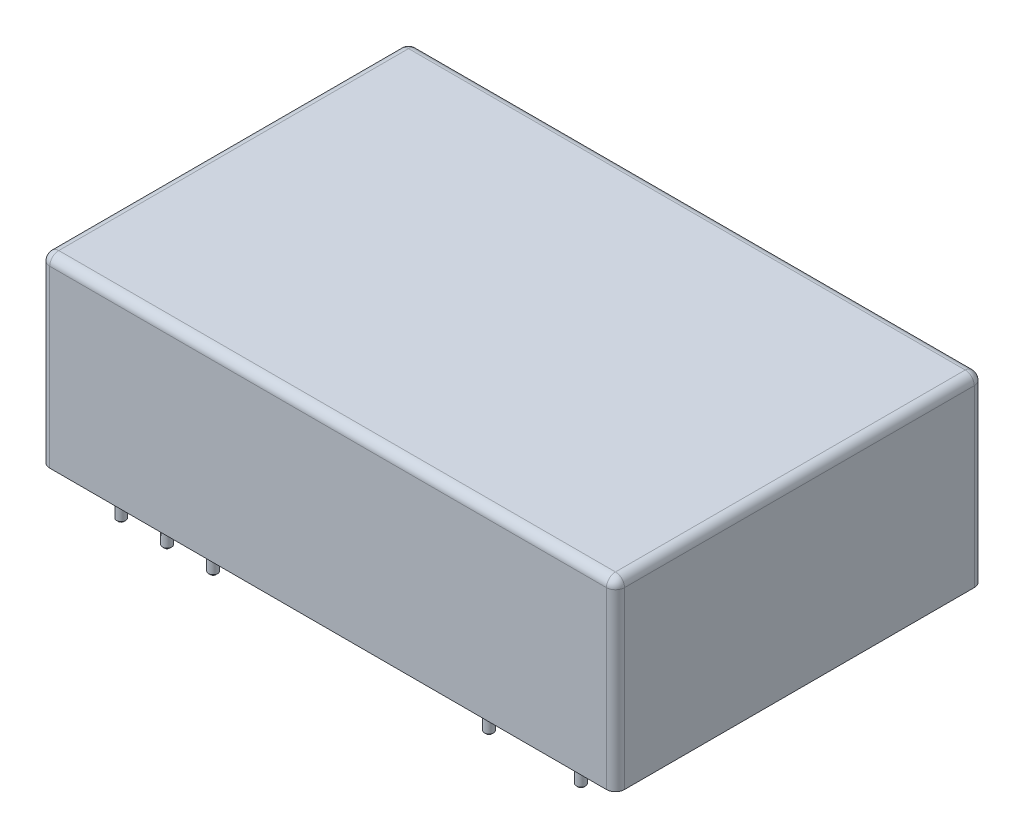
ISO-10303-21;
HEADER;
FILE_DESCRIPTION(('STEP AP214'),'2;1');
FILE_NAME('part.step','',(''),(''),'','','');
FILE_SCHEMA(('AUTOMOTIVE_DESIGN { 1 0 10303 214 1 1 1 1 }'));
ENDSEC;
DATA;
#1=APPLICATION_CONTEXT('core data for automotive mechanical design processes');
#2=APPLICATION_PROTOCOL_DEFINITION('international standard','automotive_design',2000,#1);
#3=PRODUCT_CONTEXT('',#1,'mechanical');
#4=PRODUCT('Part','Part','',(#3));
#5=PRODUCT_RELATED_PRODUCT_CATEGORY('part','',(#4));
#6=PRODUCT_DEFINITION_FORMATION('','',#4);
#7=PRODUCT_DEFINITION_CONTEXT('part definition',#1,'design');
#8=PRODUCT_DEFINITION('design','',#6,#7);
#9=PRODUCT_DEFINITION_SHAPE('','',#8);
#10=(LENGTH_UNIT() NAMED_UNIT(*) SI_UNIT(.MILLI.,.METRE.));
#11=(NAMED_UNIT(*) PLANE_ANGLE_UNIT() SI_UNIT($,.RADIAN.));
#12=(NAMED_UNIT(*) SI_UNIT($,.STERADIAN.) SOLID_ANGLE_UNIT());
#13=UNCERTAINTY_MEASURE_WITH_UNIT(LENGTH_MEASURE(1.E-05),#10,'distance_accuracy_value','');
#14=(GEOMETRIC_REPRESENTATION_CONTEXT(3) GLOBAL_UNCERTAINTY_ASSIGNED_CONTEXT((#13)) GLOBAL_UNIT_ASSIGNED_CONTEXT((#10,
#11,#12)) REPRESENTATION_CONTEXT('',''));
#15=CARTESIAN_POINT('',(0.,0.,0.));
#16=DIRECTION('',(0.,0.,1.));
#17=DIRECTION('',(1.,0.,0.));
#18=AXIS2_PLACEMENT_3D('',#15,#16,#17);
#19=CARTESIAN_POINT('',(-15.375,9.66,9.66));
#20=DIRECTION('',(1.,0.,0.));
#21=DIRECTION('',(0.,0.,-1.));
#22=AXIS2_PLACEMENT_3D('',#19,#20,#21);
#23=SPHERICAL_SURFACE('',#22,0.5);
#24=CARTESIAN_POINT('',(-15.375,9.66,9.66));
#25=DIRECTION('',(-1.,0.,0.));
#26=DIRECTION('',(0.,0.,1.));
#27=AXIS2_PLACEMENT_3D('',#24,#25,#26);
#28=CIRCLE('',#27,0.5);
#29=CARTESIAN_POINT('',(-15.375,10.16,9.66));
#30=VERTEX_POINT('',#29);
#31=CARTESIAN_POINT('',(-15.375,9.66,10.16));
#32=VERTEX_POINT('',#31);
#33=EDGE_CURVE('E201',#30,#32,#28,.F.);
#34=ORIENTED_EDGE('',*,*,#33,.F.);
#35=CARTESIAN_POINT('',(-15.375,9.66,9.66));
#36=DIRECTION('',(0.,0.,-1.));
#37=DIRECTION('',(-1.,0.,0.));
#38=AXIS2_PLACEMENT_3D('',#35,#36,#37);
#39=CIRCLE('',#38,0.5);
#40=CARTESIAN_POINT('',(-15.875,9.66,9.66));
#41=VERTEX_POINT('',#40);
#42=EDGE_CURVE('E229',#41,#30,#39,.T.);
#43=ORIENTED_EDGE('',*,*,#42,.F.);
#44=CARTESIAN_POINT('',(-15.375,9.66,9.66));
#45=DIRECTION('',(0.,-1.,0.));
#46=DIRECTION('',(0.,0.,-1.));
#47=AXIS2_PLACEMENT_3D('',#44,#45,#46);
#48=CIRCLE('',#47,0.5);
#49=EDGE_CURVE('E69',#32,#41,#48,.T.);
#50=ORIENTED_EDGE('',*,*,#49,.F.);
#51=EDGE_LOOP('',(#34,#43,#50));
#52=FACE_BOUND('',#51,.T.);
#53=ADVANCED_FACE('F16',(#52),#23,.T.);
#54=CARTESIAN_POINT('',(15.375,9.66,9.66));
#55=DIRECTION('',(1.,0.,0.));
#56=DIRECTION('',(0.,0.,-1.));
#57=AXIS2_PLACEMENT_3D('',#54,#55,#56);
#58=SPHERICAL_SURFACE('',#57,0.5);
#59=CARTESIAN_POINT('',(15.375,9.66,9.66));
#60=DIRECTION('',(0.,-1.,0.));
#61=DIRECTION('',(0.,0.,-1.));
#62=AXIS2_PLACEMENT_3D('',#59,#60,#61);
#63=CIRCLE('',#62,0.5);
#64=CARTESIAN_POINT('',(15.875,9.66,9.66));
#65=VERTEX_POINT('',#64);
#66=CARTESIAN_POINT('',(15.375,9.66,10.16));
#67=VERTEX_POINT('',#66);
#68=EDGE_CURVE('E198',#65,#67,#63,.T.);
#69=ORIENTED_EDGE('',*,*,#68,.F.);
#70=CARTESIAN_POINT('',(15.375,9.66,9.66));
#71=DIRECTION('',(0.,0.,1.));
#72=DIRECTION('',(1.,0.,0.));
#73=AXIS2_PLACEMENT_3D('',#70,#71,#72);
#74=CIRCLE('',#73,0.5);
#75=CARTESIAN_POINT('',(15.375,10.16,9.66));
#76=VERTEX_POINT('',#75);
#77=EDGE_CURVE('E191',#76,#65,#74,.F.);
#78=ORIENTED_EDGE('',*,*,#77,.F.);
#79=CARTESIAN_POINT('',(15.375,9.66,9.66));
#80=DIRECTION('',(-1.,0.,0.));
#81=DIRECTION('',(0.,0.,1.));
#82=AXIS2_PLACEMENT_3D('',#79,#80,#81);
#83=CIRCLE('',#82,0.5);
#84=EDGE_CURVE('E205',#67,#76,#83,.T.);
#85=ORIENTED_EDGE('',*,*,#84,.F.);
#86=EDGE_LOOP('',(#69,#78,#85));
#87=FACE_BOUND('',#86,.T.);
#88=ADVANCED_FACE('F252',(#87),#58,.T.);
#89=CARTESIAN_POINT('',(15.375,9.66,-9.66));
#90=DIRECTION('',(1.,0.,0.));
#91=DIRECTION('',(0.,0.,-1.));
#92=AXIS2_PLACEMENT_3D('',#89,#90,#91);
#93=SPHERICAL_SURFACE('',#92,0.5);
#94=CARTESIAN_POINT('',(15.375,9.66,-9.66));
#95=DIRECTION('',(0.,-1.,0.));
#96=DIRECTION('',(0.,0.,-1.));
#97=AXIS2_PLACEMENT_3D('',#94,#95,#96);
#98=CIRCLE('',#97,0.5);
#99=CARTESIAN_POINT('',(15.375,9.66,-10.16));
#100=VERTEX_POINT('',#99);
#101=CARTESIAN_POINT('',(15.875,9.66,-9.66));
#102=VERTEX_POINT('',#101);
#103=EDGE_CURVE('E175',#100,#102,#98,.T.);
#104=ORIENTED_EDGE('',*,*,#103,.F.);
#105=CARTESIAN_POINT('',(15.375,9.66,-9.66));
#106=DIRECTION('',(1.,0.,0.));
#107=DIRECTION('',(0.,0.,-1.));
#108=AXIS2_PLACEMENT_3D('',#105,#106,#107);
#109=CIRCLE('',#108,0.5);
#110=CARTESIAN_POINT('',(15.375,10.16,-9.66));
#111=VERTEX_POINT('',#110);
#112=EDGE_CURVE('E170',#111,#100,#109,.F.);
#113=ORIENTED_EDGE('',*,*,#112,.F.);
#114=CARTESIAN_POINT('',(15.375,9.66,-9.66));
#115=DIRECTION('',(0.,0.,1.));
#116=DIRECTION('',(1.,0.,0.));
#117=AXIS2_PLACEMENT_3D('',#114,#115,#116);
#118=CIRCLE('',#117,0.5);
#119=EDGE_CURVE('E187',#102,#111,#118,.T.);
#120=ORIENTED_EDGE('',*,*,#119,.F.);
#121=EDGE_LOOP('',(#104,#113,#120));
#122=FACE_BOUND('',#121,.T.);
#123=ADVANCED_FACE('F248',(#122),#93,.T.);
#124=CARTESIAN_POINT('',(0.,10.16,0.));
#125=DIRECTION('',(0.,1.,0.));
#126=DIRECTION('',(0.,0.,1.));
#127=AXIS2_PLACEMENT_3D('',#124,#125,#126);
#128=PLANE('',#127);
#129=DIRECTION('',(1.,0.,0.));
#130=VECTOR('',#129,1.);
#131=CARTESIAN_POINT('',(0.,10.16,-9.66));
#132=LINE('',#131,#130);
#133=CARTESIAN_POINT('',(-15.375,10.16,-9.66));
#134=VERTEX_POINT('',#133);
#135=EDGE_CURVE('E160',#134,#111,#132,.T.);
#136=ORIENTED_EDGE('',*,*,#135,.F.);
#137=DIRECTION('',(0.,0.,-1.));
#138=VECTOR('',#137,1.);
#139=CARTESIAN_POINT('',(-15.375,10.16,0.));
#140=LINE('',#139,#138);
#141=EDGE_CURVE('E226',#30,#134,#140,.T.);
#142=ORIENTED_EDGE('',*,*,#141,.F.);
#143=DIRECTION('',(-1.,0.,0.));
#144=VECTOR('',#143,1.);
#145=CARTESIAN_POINT('',(0.,10.16,9.66));
#146=LINE('',#145,#144);
#147=EDGE_CURVE('E213',#76,#30,#146,.T.);
#148=ORIENTED_EDGE('',*,*,#147,.F.);
#149=DIRECTION('',(0.,0.,1.));
#150=VECTOR('',#149,1.);
#151=CARTESIAN_POINT('',(15.375,10.16,0.));
#152=LINE('',#151,#150);
#153=EDGE_CURVE('E190',#111,#76,#152,.T.);
#154=ORIENTED_EDGE('',*,*,#153,.F.);
#155=EDGE_LOOP('',(#136,#142,#148,#154));
#156=FACE_BOUND('',#155,.T.);
#157=ADVANCED_FACE('F243',(#156),#128,.T.);
#158=CARTESIAN_POINT('',(-15.375,9.66,-9.66));
#159=DIRECTION('',(1.,0.,0.));
#160=DIRECTION('',(0.,0.,-1.));
#161=AXIS2_PLACEMENT_3D('',#158,#159,#160);
#162=SPHERICAL_SURFACE('',#161,0.5);
#163=CARTESIAN_POINT('',(-15.375,9.66,-9.66));
#164=DIRECTION('',(1.,0.,0.));
#165=DIRECTION('',(0.,0.,-1.));
#166=AXIS2_PLACEMENT_3D('',#163,#164,#165);
#167=CIRCLE('',#166,0.5);
#168=CARTESIAN_POINT('',(-15.375,9.66,-10.16));
#169=VERTEX_POINT('',#168);
#170=EDGE_CURVE('E167',#169,#134,#167,.T.);
#171=ORIENTED_EDGE('',*,*,#170,.F.);
#172=CARTESIAN_POINT('',(-15.375,9.66,-9.66));
#173=DIRECTION('',(0.,-1.,0.));
#174=DIRECTION('',(0.,0.,-1.));
#175=AXIS2_PLACEMENT_3D('',#172,#173,#174);
#176=CIRCLE('',#175,0.5);
#177=CARTESIAN_POINT('',(-15.875,9.66,-9.66));
#178=VERTEX_POINT('',#177);
#179=EDGE_CURVE('E157',#178,#169,#176,.T.);
#180=ORIENTED_EDGE('',*,*,#179,.F.);
#181=CARTESIAN_POINT('',(-15.375,9.66,-9.66));
#182=DIRECTION('',(0.,0.,-1.));
#183=DIRECTION('',(-1.,0.,0.));
#184=AXIS2_PLACEMENT_3D('',#181,#182,#183);
#185=CIRCLE('',#184,0.5);
#186=EDGE_CURVE('E70',#134,#178,#185,.F.);
#187=ORIENTED_EDGE('',*,*,#186,.F.);
#188=EDGE_LOOP('',(#171,#180,#187));
#189=FACE_BOUND('',#188,.T.);
#190=ADVANCED_FACE('F238',(#189),#162,.T.);
#191=CARTESIAN_POINT('',(-11.43,-3.05,7.62));
#192=DIRECTION('',(0.,-1.,0.));
#193=DIRECTION('',(0.,0.,-1.));
#194=AXIS2_PLACEMENT_3D('',#191,#192,#193);
#195=PLANE('',#194);
#196=CARTESIAN_POINT('',(-11.43,-3.04999999997335,7.62));
#197=DIRECTION('',(0.,1.,0.));
#198=DIRECTION('',(-1.,0.,0.));
#199=AXIS2_PLACEMENT_3D('',#196,#197,#198);
#200=CIRCLE('',#199,0.149999999936772);
#201=CARTESIAN_POINT('',(-11.5799999999368,-3.04999999997335,7.62));
#202=VERTEX_POINT('',#201);
#203=EDGE_CURVE('E318',#202,#202,#200,.T.);
#204=ORIENTED_EDGE('',*,*,#203,.F.);
#205=EDGE_LOOP('',(#204));
#206=FACE_BOUND('',#205,.T.);
#207=ADVANCED_FACE('F242',(#206),#195,.T.);
#208=CARTESIAN_POINT('',(-11.43,-3.05,-7.62));
#209=DIRECTION('',(0.,-1.,0.));
#210=DIRECTION('',(0.,0.,-1.));
#211=AXIS2_PLACEMENT_3D('',#208,#209,#210);
#212=PLANE('',#211);
#213=CARTESIAN_POINT('',(-11.43,-3.04999999991651,-7.62));
#214=DIRECTION('',(0.,1.,0.));
#215=DIRECTION('',(-1.,0.,0.));
#216=AXIS2_PLACEMENT_3D('',#213,#214,#215);
#217=CIRCLE('',#216,0.150000000044765);
#218=CARTESIAN_POINT('',(-11.5800000000448,-3.04999999991651,-7.62));
#219=VERTEX_POINT('',#218);
#220=EDGE_CURVE('E315',#219,#219,#217,.T.);
#221=ORIENTED_EDGE('',*,*,#220,.F.);
#222=EDGE_LOOP('',(#221));
#223=FACE_BOUND('',#222,.T.);
#224=ADVANCED_FACE('F508',(#223),#212,.T.);
#225=CARTESIAN_POINT('',(-13.97,-3.05,7.62));
#226=DIRECTION('',(0.,-1.,0.));
#227=DIRECTION('',(0.,0.,-1.));
#228=AXIS2_PLACEMENT_3D('',#225,#226,#227);
#229=PLANE('',#228);
#230=CARTESIAN_POINT('',(-13.97,-3.04999999997335,7.62));
#231=DIRECTION('',(0.,1.,0.));
#232=DIRECTION('',(-1.,0.,0.));
#233=AXIS2_PLACEMENT_3D('',#230,#231,#232);
#234=CIRCLE('',#233,0.149999999936772);
#235=CARTESIAN_POINT('',(-14.1199999999368,-3.04999999997335,7.62));
#236=VERTEX_POINT('',#235);
#237=EDGE_CURVE('E312',#236,#236,#234,.T.);
#238=ORIENTED_EDGE('',*,*,#237,.F.);
#239=EDGE_LOOP('',(#238));
#240=FACE_BOUND('',#239,.T.);
#241=ADVANCED_FACE('F505',(#240),#229,.T.);
#242=CARTESIAN_POINT('',(-8.89,-3.05,-7.62));
#243=DIRECTION('',(0.,-1.,0.));
#244=DIRECTION('',(0.,0.,-1.));
#245=AXIS2_PLACEMENT_3D('',#242,#243,#244);
#246=PLANE('',#245);
#247=CARTESIAN_POINT('',(-8.89,-3.04999999991651,-7.62));
#248=DIRECTION('',(0.,1.,0.));
#249=DIRECTION('',(-1.,0.,0.));
#250=AXIS2_PLACEMENT_3D('',#247,#248,#249);
#251=CIRCLE('',#250,0.150000000044765);
#252=CARTESIAN_POINT('',(-9.04000000004477,-3.04999999991651,-7.62));
#253=VERTEX_POINT('',#252);
#254=EDGE_CURVE('E309',#253,#253,#251,.T.);
#255=ORIENTED_EDGE('',*,*,#254,.F.);
#256=EDGE_LOOP('',(#255));
#257=FACE_BOUND('',#256,.T.);
#258=ADVANCED_FACE('F501',(#257),#246,.T.);
#259=CARTESIAN_POINT('',(6.35,-3.05,-7.62));
#260=DIRECTION('',(0.,-1.,0.));
#261=DIRECTION('',(0.,0.,-1.));
#262=AXIS2_PLACEMENT_3D('',#259,#260,#261);
#263=PLANE('',#262);
#264=CARTESIAN_POINT('',(6.35,-3.04999999991651,-7.62));
#265=DIRECTION('',(0.,1.,0.));
#266=DIRECTION('',(-1.,0.,0.));
#267=AXIS2_PLACEMENT_3D('',#264,#265,#266);
#268=CIRCLE('',#267,0.150000000044765);
#269=CARTESIAN_POINT('',(6.19999999995523,-3.04999999991651,-7.62));
#270=VERTEX_POINT('',#269);
#271=EDGE_CURVE('E306',#270,#270,#268,.T.);
#272=ORIENTED_EDGE('',*,*,#271,.F.);
#273=EDGE_LOOP('',(#272));
#274=FACE_BOUND('',#273,.T.);
#275=ADVANCED_FACE('F497',(#274),#263,.T.);
#276=CARTESIAN_POINT('',(11.43,-3.05,-7.62));
#277=DIRECTION('',(0.,-1.,0.));
#278=DIRECTION('',(0.,0.,-1.));
#279=AXIS2_PLACEMENT_3D('',#276,#277,#278);
#280=PLANE('',#279);
#281=CARTESIAN_POINT('',(11.43,-3.04999999991651,-7.62));
#282=DIRECTION('',(0.,1.,0.));
#283=DIRECTION('',(-1.,0.,0.));
#284=AXIS2_PLACEMENT_3D('',#281,#282,#283);
#285=CIRCLE('',#284,0.150000000044765);
#286=CARTESIAN_POINT('',(11.2799999999552,-3.04999999991651,-7.62));
#287=VERTEX_POINT('',#286);
#288=EDGE_CURVE('E303',#287,#287,#285,.T.);
#289=ORIENTED_EDGE('',*,*,#288,.F.);
#290=EDGE_LOOP('',(#289));
#291=FACE_BOUND('',#290,.T.);
#292=ADVANCED_FACE('F493',(#291),#280,.T.);
#293=CARTESIAN_POINT('',(-8.89,-3.05,7.62));
#294=DIRECTION('',(0.,-1.,0.));
#295=DIRECTION('',(0.,0.,-1.));
#296=AXIS2_PLACEMENT_3D('',#293,#294,#295);
#297=PLANE('',#296);
#298=CARTESIAN_POINT('',(-8.89,-3.04999999997335,7.62));
#299=DIRECTION('',(0.,1.,0.));
#300=DIRECTION('',(-1.,0.,0.));
#301=AXIS2_PLACEMENT_3D('',#298,#299,#300);
#302=CIRCLE('',#301,0.149999999936772);
#303=CARTESIAN_POINT('',(-9.03999999993677,-3.04999999997335,7.62));
#304=VERTEX_POINT('',#303);
#305=EDGE_CURVE('E300',#304,#304,#302,.T.);
#306=ORIENTED_EDGE('',*,*,#305,.F.);
#307=EDGE_LOOP('',(#306));
#308=FACE_BOUND('',#307,.T.);
#309=ADVANCED_FACE('F489',(#308),#297,.T.);
#310=CARTESIAN_POINT('',(6.35,-3.05,7.62));
#311=DIRECTION('',(0.,-1.,0.));
#312=DIRECTION('',(0.,0.,-1.));
#313=AXIS2_PLACEMENT_3D('',#310,#311,#312);
#314=PLANE('',#313);
#315=CARTESIAN_POINT('',(6.35,-3.04999999997335,7.62));
#316=DIRECTION('',(0.,1.,0.));
#317=DIRECTION('',(-1.,0.,0.));
#318=AXIS2_PLACEMENT_3D('',#315,#316,#317);
#319=CIRCLE('',#318,0.149999999936772);
#320=CARTESIAN_POINT('',(6.20000000006323,-3.04999999997335,7.62));
#321=VERTEX_POINT('',#320);
#322=EDGE_CURVE('E297',#321,#321,#319,.T.);
#323=ORIENTED_EDGE('',*,*,#322,.F.);
#324=EDGE_LOOP('',(#323));
#325=FACE_BOUND('',#324,.T.);
#326=ADVANCED_FACE('F485',(#325),#314,.T.);
#327=CARTESIAN_POINT('',(11.43,-3.05,7.62));
#328=DIRECTION('',(0.,-1.,0.));
#329=DIRECTION('',(0.,0.,-1.));
#330=AXIS2_PLACEMENT_3D('',#327,#328,#329);
#331=PLANE('',#330);
#332=CARTESIAN_POINT('',(11.43,-3.04999999997335,7.62));
#333=DIRECTION('',(0.,1.,0.));
#334=DIRECTION('',(-1.,0.,0.));
#335=AXIS2_PLACEMENT_3D('',#332,#333,#334);
#336=CIRCLE('',#335,0.149999999936772);
#337=CARTESIAN_POINT('',(11.2800000000632,-3.04999999997335,7.62));
#338=VERTEX_POINT('',#337);
#339=EDGE_CURVE('E129',#338,#338,#336,.T.);
#340=ORIENTED_EDGE('',*,*,#339,.F.);
#341=EDGE_LOOP('',(#340));
#342=FACE_BOUND('',#341,.T.);
#343=ADVANCED_FACE('F482',(#342),#331,.T.);
#344=CARTESIAN_POINT('',(-15.375,9.66,0.));
#345=DIRECTION('',(0.,0.,-1.));
#346=DIRECTION('',(-1.,0.,0.));
#347=AXIS2_PLACEMENT_3D('',#344,#345,#346);
#348=CYLINDRICAL_SURFACE('',#347,0.5);
#349=ORIENTED_EDGE('',*,*,#186,.T.);
#350=DIRECTION('',(0.,0.,-1.));
#351=VECTOR('',#350,1.);
#352=CARTESIAN_POINT('',(-15.875,9.66,10.16));
#353=LINE('',#352,#351);
#354=EDGE_CURVE('E120',#178,#41,#353,.F.);
#355=ORIENTED_EDGE('',*,*,#354,.T.);
#356=ORIENTED_EDGE('',*,*,#42,.T.);
#357=ORIENTED_EDGE('',*,*,#141,.T.);
#358=EDGE_LOOP('',(#349,#355,#356,#357));
#359=FACE_BOUND('',#358,.T.);
#360=ADVANCED_FACE('F363',(#359),#348,.T.);
#361=CARTESIAN_POINT('',(-15.375,10.16,9.66));
#362=DIRECTION('',(0.,-1.,0.));
#363=DIRECTION('',(0.,0.,-1.));
#364=AXIS2_PLACEMENT_3D('',#361,#362,#363);
#365=CYLINDRICAL_SURFACE('',#364,0.5);
#366=ORIENTED_EDGE('',*,*,#49,.T.);
#367=DIRECTION('',(0.,1.,0.));
#368=VECTOR('',#367,1.);
#369=CARTESIAN_POINT('',(-15.875,10.16,9.66));
#370=LINE('',#369,#368);
#371=CARTESIAN_POINT('',(-15.875,0.,9.66));
#372=VERTEX_POINT('',#371);
#373=EDGE_CURVE('E67',#41,#372,#370,.F.);
#374=ORIENTED_EDGE('',*,*,#373,.T.);
#375=CARTESIAN_POINT('',(-15.375,0.,9.66));
#376=DIRECTION('',(0.,-1.,0.));
#377=DIRECTION('',(0.,0.,-1.));
#378=AXIS2_PLACEMENT_3D('',#375,#376,#377);
#379=CIRCLE('',#378,0.5);
#380=CARTESIAN_POINT('',(-15.375,0.,10.16));
#381=VERTEX_POINT('',#380);
#382=EDGE_CURVE('E20',#372,#381,#379,.F.);
#383=ORIENTED_EDGE('',*,*,#382,.T.);
#384=DIRECTION('',(0.,1.,0.));
#385=VECTOR('',#384,1.);
#386=CARTESIAN_POINT('',(-15.375,10.16,10.16));
#387=LINE('',#386,#385);
#388=EDGE_CURVE('E65',#381,#32,#387,.T.);
#389=ORIENTED_EDGE('',*,*,#388,.T.);
#390=EDGE_LOOP('',(#366,#374,#383,#389));
#391=FACE_BOUND('',#390,.T.);
#392=ADVANCED_FACE('F63',(#391),#365,.T.);
#393=CARTESIAN_POINT('',(0.,9.66,9.66));
#394=DIRECTION('',(-1.,0.,0.));
#395=DIRECTION('',(0.,0.,1.));
#396=AXIS2_PLACEMENT_3D('',#393,#394,#395);
#397=CYLINDRICAL_SURFACE('',#396,0.5);
#398=ORIENTED_EDGE('',*,*,#33,.T.);
#399=DIRECTION('',(-1.,0.,0.));
#400=VECTOR('',#399,1.);
#401=CARTESIAN_POINT('',(15.875,9.66,10.16));
#402=LINE('',#401,#400);
#403=EDGE_CURVE('E78',#32,#67,#402,.F.);
#404=ORIENTED_EDGE('',*,*,#403,.T.);
#405=ORIENTED_EDGE('',*,*,#84,.T.);
#406=ORIENTED_EDGE('',*,*,#147,.T.);
#407=EDGE_LOOP('',(#398,#404,#405,#406));
#408=FACE_BOUND('',#407,.T.);
#409=ADVANCED_FACE('F370',(#408),#397,.T.);
#410=CARTESIAN_POINT('',(15.375,10.16,9.66));
#411=DIRECTION('',(0.,-1.,0.));
#412=DIRECTION('',(0.,0.,-1.));
#413=AXIS2_PLACEMENT_3D('',#410,#411,#412);
#414=CYLINDRICAL_SURFACE('',#413,0.5);
#415=CARTESIAN_POINT('',(15.375,0.,9.66));
#416=DIRECTION('',(0.,-1.,0.));
#417=DIRECTION('',(0.,0.,-1.));
#418=AXIS2_PLACEMENT_3D('',#415,#416,#417);
#419=CIRCLE('',#418,0.5);
#420=CARTESIAN_POINT('',(15.375,0.,10.16));
#421=VERTEX_POINT('',#420);
#422=CARTESIAN_POINT('',(15.875,0.,9.66));
#423=VERTEX_POINT('',#422);
#424=EDGE_CURVE('E83',#421,#423,#419,.F.);
#425=ORIENTED_EDGE('',*,*,#424,.T.);
#426=DIRECTION('',(0.,1.,0.));
#427=VECTOR('',#426,1.);
#428=CARTESIAN_POINT('',(15.875,10.16,9.66));
#429=LINE('',#428,#427);
#430=EDGE_CURVE('E107',#423,#65,#429,.T.);
#431=ORIENTED_EDGE('',*,*,#430,.T.);
#432=ORIENTED_EDGE('',*,*,#68,.T.);
#433=DIRECTION('',(0.,1.,0.));
#434=VECTOR('',#433,1.);
#435=CARTESIAN_POINT('',(15.375,10.16,10.16));
#436=LINE('',#435,#434);
#437=EDGE_CURVE('E79',#67,#421,#436,.F.);
#438=ORIENTED_EDGE('',*,*,#437,.T.);
#439=EDGE_LOOP('',(#425,#431,#432,#438));
#440=FACE_BOUND('',#439,.T.);
#441=ADVANCED_FACE('F324',(#440),#414,.T.);
#442=CARTESIAN_POINT('',(15.375,9.66,0.));
#443=DIRECTION('',(0.,0.,1.));
#444=DIRECTION('',(1.,0.,0.));
#445=AXIS2_PLACEMENT_3D('',#442,#443,#444);
#446=CYLINDRICAL_SURFACE('',#445,0.5);
#447=ORIENTED_EDGE('',*,*,#119,.T.);
#448=ORIENTED_EDGE('',*,*,#153,.T.);
#449=ORIENTED_EDGE('',*,*,#77,.T.);
#450=DIRECTION('',(0.,0.,1.));
#451=VECTOR('',#450,1.);
#452=CARTESIAN_POINT('',(15.875,9.66,10.16));
#453=LINE('',#452,#451);
#454=EDGE_CURVE('E110',#65,#102,#453,.F.);
#455=ORIENTED_EDGE('',*,*,#454,.T.);
#456=EDGE_LOOP('',(#447,#448,#449,#455));
#457=FACE_BOUND('',#456,.T.);
#458=ADVANCED_FACE('F340',(#457),#446,.T.);
#459=CARTESIAN_POINT('',(15.375,10.16,-9.66));
#460=DIRECTION('',(0.,-1.,0.));
#461=DIRECTION('',(0.,0.,-1.));
#462=AXIS2_PLACEMENT_3D('',#459,#460,#461);
#463=CYLINDRICAL_SURFACE('',#462,0.5);
#464=ORIENTED_EDGE('',*,*,#103,.T.);
#465=DIRECTION('',(0.,1.,0.));
#466=VECTOR('',#465,1.);
#467=CARTESIAN_POINT('',(15.875,10.16,-9.66));
#468=LINE('',#467,#466);
#469=CARTESIAN_POINT('',(15.875,0.,-9.66));
#470=VERTEX_POINT('',#469);
#471=EDGE_CURVE('E99',#102,#470,#468,.F.);
#472=ORIENTED_EDGE('',*,*,#471,.T.);
#473=CARTESIAN_POINT('',(15.375,0.,-9.66));
#474=DIRECTION('',(0.,-1.,0.));
#475=DIRECTION('',(0.,0.,-1.));
#476=AXIS2_PLACEMENT_3D('',#473,#474,#475);
#477=CIRCLE('',#476,0.5);
#478=CARTESIAN_POINT('',(15.375,0.,-10.16));
#479=VERTEX_POINT('',#478);
#480=EDGE_CURVE('E180',#470,#479,#477,.F.);
#481=ORIENTED_EDGE('',*,*,#480,.T.);
#482=DIRECTION('',(0.,1.,0.));
#483=VECTOR('',#482,1.);
#484=CARTESIAN_POINT('',(15.375,10.16,-10.16));
#485=LINE('',#484,#483);
#486=EDGE_CURVE('E95',#479,#100,#485,.T.);
#487=ORIENTED_EDGE('',*,*,#486,.T.);
#488=EDGE_LOOP('',(#464,#472,#481,#487));
#489=FACE_BOUND('',#488,.T.);
#490=ADVANCED_FACE('F333',(#489),#463,.T.);
#491=CARTESIAN_POINT('',(0.,9.66,-9.66));
#492=DIRECTION('',(1.,0.,0.));
#493=DIRECTION('',(0.,0.,-1.));
#494=AXIS2_PLACEMENT_3D('',#491,#492,#493);
#495=CYLINDRICAL_SURFACE('',#494,0.5);
#496=ORIENTED_EDGE('',*,*,#170,.T.);
#497=ORIENTED_EDGE('',*,*,#135,.T.);
#498=ORIENTED_EDGE('',*,*,#112,.T.);
#499=DIRECTION('',(1.,0.,0.));
#500=VECTOR('',#499,1.);
#501=CARTESIAN_POINT('',(15.875,9.66,-10.16));
#502=LINE('',#501,#500);
#503=EDGE_CURVE('E98',#100,#169,#502,.F.);
#504=ORIENTED_EDGE('',*,*,#503,.T.);
#505=EDGE_LOOP('',(#496,#497,#498,#504));
#506=FACE_BOUND('',#505,.T.);
#507=ADVANCED_FACE('F375',(#506),#495,.T.);
#508=CARTESIAN_POINT('',(-15.375,10.16,-9.66));
#509=DIRECTION('',(0.,-1.,0.));
#510=DIRECTION('',(0.,0.,-1.));
#511=AXIS2_PLACEMENT_3D('',#508,#509,#510);
#512=CYLINDRICAL_SURFACE('',#511,0.5);
#513=CARTESIAN_POINT('',(-15.375,0.,-9.66));
#514=DIRECTION('',(0.,-1.,0.));
#515=DIRECTION('',(0.,0.,-1.));
#516=AXIS2_PLACEMENT_3D('',#513,#514,#515);
#517=CIRCLE('',#516,0.5);
#518=CARTESIAN_POINT('',(-15.375,0.,-10.16));
#519=VERTEX_POINT('',#518);
#520=CARTESIAN_POINT('',(-15.875,0.,-9.66));
#521=VERTEX_POINT('',#520);
#522=EDGE_CURVE('E35',#519,#521,#517,.F.);
#523=ORIENTED_EDGE('',*,*,#522,.T.);
#524=DIRECTION('',(0.,1.,0.));
#525=VECTOR('',#524,1.);
#526=CARTESIAN_POINT('',(-15.875,10.16,-9.66));
#527=LINE('',#526,#525);
#528=EDGE_CURVE('E123',#521,#178,#527,.T.);
#529=ORIENTED_EDGE('',*,*,#528,.T.);
#530=ORIENTED_EDGE('',*,*,#179,.T.);
#531=DIRECTION('',(0.,1.,0.));
#532=VECTOR('',#531,1.);
#533=CARTESIAN_POINT('',(-15.375,10.16,-10.16));
#534=LINE('',#533,#532);
#535=EDGE_CURVE('E102',#169,#519,#534,.F.);
#536=ORIENTED_EDGE('',*,*,#535,.T.);
#537=EDGE_LOOP('',(#523,#529,#530,#536));
#538=FACE_BOUND('',#537,.T.);
#539=ADVANCED_FACE('F383',(#538),#512,.T.);
#540=CARTESIAN_POINT('',(-11.43,-2.94999999999845,7.62));
#541=DIRECTION('',(0.,1.,0.));
#542=DIRECTION('',(-1.,0.,0.));
#543=AXIS2_PLACEMENT_3D('',#540,#541,#542);
#544=CONICAL_SURFACE('',#543,0.24999999991167,0.785398163397448);
#545=ORIENTED_EDGE('',*,*,#203,.T.);
#546=EDGE_LOOP('',(#545));
#547=FACE_BOUND('',#546,.T.);
#548=CARTESIAN_POINT('',(-11.43,-2.95,7.62));
#549=DIRECTION('',(0.,1.,0.));
#550=DIRECTION('',(0.,0.,1.));
#551=AXIS2_PLACEMENT_3D('',#548,#549,#550);
#552=CIRCLE('',#551,0.25);
#553=CARTESIAN_POINT('',(-11.43,-2.95,7.87));
#554=VERTEX_POINT('',#553);
#555=EDGE_CURVE('E104',#554,#554,#552,.T.);
#556=ORIENTED_EDGE('',*,*,#555,.F.);
#557=EDGE_LOOP('',(#556));
#558=FACE_BOUND('',#557,.T.);
#559=ADVANCED_FACE('F452',(#547,#558),#544,.T.);
#560=CARTESIAN_POINT('',(-11.43,-2.94999999999845,-7.62));
#561=DIRECTION('',(0.,1.,0.));
#562=DIRECTION('',(-1.,0.,0.));
#563=AXIS2_PLACEMENT_3D('',#560,#561,#562);
#564=CONICAL_SURFACE('',#563,0.249999999905976,0.785398163113231);
#565=ORIENTED_EDGE('',*,*,#220,.T.);
#566=EDGE_LOOP('',(#565));
#567=FACE_BOUND('',#566,.T.);
#568=CARTESIAN_POINT('',(-11.43,-2.95,-7.62));
#569=DIRECTION('',(0.,1.,0.));
#570=DIRECTION('',(0.,0.,1.));
#571=AXIS2_PLACEMENT_3D('',#568,#569,#570);
#572=CIRCLE('',#571,0.25);
#573=CARTESIAN_POINT('',(-11.43,-2.95,-7.37));
#574=VERTEX_POINT('',#573);
#575=EDGE_CURVE('E152',#574,#574,#572,.T.);
#576=ORIENTED_EDGE('',*,*,#575,.F.);
#577=EDGE_LOOP('',(#576));
#578=FACE_BOUND('',#577,.T.);
#579=ADVANCED_FACE('F449',(#567,#578),#564,.T.);
#580=CARTESIAN_POINT('',(-13.97,-2.94999999999845,7.62));
#581=DIRECTION('',(0.,1.,0.));
#582=DIRECTION('',(-1.,0.,0.));
#583=AXIS2_PLACEMENT_3D('',#580,#581,#582);
#584=CONICAL_SURFACE('',#583,0.24999999991167,0.785398163397448);
#585=ORIENTED_EDGE('',*,*,#237,.T.);
#586=EDGE_LOOP('',(#585));
#587=FACE_BOUND('',#586,.T.);
#588=CARTESIAN_POINT('',(-13.97,-2.95,7.62));
#589=DIRECTION('',(0.,1.,0.));
#590=DIRECTION('',(0.,0.,1.));
#591=AXIS2_PLACEMENT_3D('',#588,#589,#590);
#592=CIRCLE('',#591,0.25);
#593=CARTESIAN_POINT('',(-13.97,-2.95,7.87));
#594=VERTEX_POINT('',#593);
#595=EDGE_CURVE('E149',#594,#594,#592,.T.);
#596=ORIENTED_EDGE('',*,*,#595,.F.);
#597=EDGE_LOOP('',(#596));
#598=FACE_BOUND('',#597,.T.);
#599=ADVANCED_FACE('F451',(#587,#598),#584,.T.);
#600=CARTESIAN_POINT('',(-8.89,-2.94999999999845,-7.62));
#601=DIRECTION('',(0.,1.,0.));
#602=DIRECTION('',(-1.,0.,0.));
#603=AXIS2_PLACEMENT_3D('',#600,#601,#602);
#604=CONICAL_SURFACE('',#603,0.249999999905976,0.785398163113231);
#605=ORIENTED_EDGE('',*,*,#254,.T.);
#606=EDGE_LOOP('',(#605));
#607=FACE_BOUND('',#606,.T.);
#608=CARTESIAN_POINT('',(-8.89,-2.95,-7.62));
#609=DIRECTION('',(0.,1.,0.));
#610=DIRECTION('',(0.,0.,1.));
#611=AXIS2_PLACEMENT_3D('',#608,#609,#610);
#612=CIRCLE('',#611,0.25);
#613=CARTESIAN_POINT('',(-8.89,-2.95,-7.37));
#614=VERTEX_POINT('',#613);
#615=EDGE_CURVE('E146',#614,#614,#612,.T.);
#616=ORIENTED_EDGE('',*,*,#615,.F.);
#617=EDGE_LOOP('',(#616));
#618=FACE_BOUND('',#617,.T.);
#619=ADVANCED_FACE('F459',(#607,#618),#604,.T.);
#620=CARTESIAN_POINT('',(6.35,-2.94999999999845,-7.62));
#621=DIRECTION('',(0.,1.,0.));
#622=DIRECTION('',(-1.,0.,0.));
#623=AXIS2_PLACEMENT_3D('',#620,#621,#622);
#624=CONICAL_SURFACE('',#623,0.249999999905976,0.785398163113231);
#625=ORIENTED_EDGE('',*,*,#271,.T.);
#626=EDGE_LOOP('',(#625));
#627=FACE_BOUND('',#626,.T.);
#628=CARTESIAN_POINT('',(6.35,-2.95,-7.62));
#629=DIRECTION('',(0.,1.,0.));
#630=DIRECTION('',(0.,0.,1.));
#631=AXIS2_PLACEMENT_3D('',#628,#629,#630);
#632=CIRCLE('',#631,0.25);
#633=CARTESIAN_POINT('',(6.35,-2.95,-7.37));
#634=VERTEX_POINT('',#633);
#635=EDGE_CURVE('E143',#634,#634,#632,.T.);
#636=ORIENTED_EDGE('',*,*,#635,.F.);
#637=EDGE_LOOP('',(#636));
#638=FACE_BOUND('',#637,.T.);
#639=ADVANCED_FACE('F740',(#627,#638),#624,.T.);
#640=CARTESIAN_POINT('',(11.43,-2.94999999999845,-7.62));
#641=DIRECTION('',(0.,1.,0.));
#642=DIRECTION('',(-1.,0.,0.));
#643=AXIS2_PLACEMENT_3D('',#640,#641,#642);
#644=CONICAL_SURFACE('',#643,0.249999999905976,0.785398163113231);
#645=ORIENTED_EDGE('',*,*,#288,.T.);
#646=EDGE_LOOP('',(#645));
#647=FACE_BOUND('',#646,.T.);
#648=CARTESIAN_POINT('',(11.43,-2.95,-7.62));
#649=DIRECTION('',(0.,1.,0.));
#650=DIRECTION('',(0.,0.,1.));
#651=AXIS2_PLACEMENT_3D('',#648,#649,#650);
#652=CIRCLE('',#651,0.25);
#653=CARTESIAN_POINT('',(11.43,-2.95,-7.37));
#654=VERTEX_POINT('',#653);
#655=EDGE_CURVE('E140',#654,#654,#652,.T.);
#656=ORIENTED_EDGE('',*,*,#655,.F.);
#657=EDGE_LOOP('',(#656));
#658=FACE_BOUND('',#657,.T.);
#659=ADVANCED_FACE('F750',(#647,#658),#644,.T.);
#660=CARTESIAN_POINT('',(-8.89,-2.94999999999845,7.62));
#661=DIRECTION('',(0.,1.,0.));
#662=DIRECTION('',(-1.,0.,0.));
#663=AXIS2_PLACEMENT_3D('',#660,#661,#662);
#664=CONICAL_SURFACE('',#663,0.24999999991167,0.785398163397448);
#665=ORIENTED_EDGE('',*,*,#305,.T.);
#666=EDGE_LOOP('',(#665));
#667=FACE_BOUND('',#666,.T.);
#668=CARTESIAN_POINT('',(-8.89,-2.95,7.62));
#669=DIRECTION('',(0.,1.,0.));
#670=DIRECTION('',(0.,0.,1.));
#671=AXIS2_PLACEMENT_3D('',#668,#669,#670);
#672=CIRCLE('',#671,0.25);
#673=CARTESIAN_POINT('',(-8.89,-2.95,7.87));
#674=VERTEX_POINT('',#673);
#675=EDGE_CURVE('E137',#674,#674,#672,.T.);
#676=ORIENTED_EDGE('',*,*,#675,.F.);
#677=EDGE_LOOP('',(#676));
#678=FACE_BOUND('',#677,.T.);
#679=ADVANCED_FACE('F761',(#667,#678),#664,.T.);
#680=CARTESIAN_POINT('',(6.35,-2.94999999999845,7.62));
#681=DIRECTION('',(0.,1.,0.));
#682=DIRECTION('',(-1.,0.,0.));
#683=AXIS2_PLACEMENT_3D('',#680,#681,#682);
#684=CONICAL_SURFACE('',#683,0.24999999991167,0.785398163397448);
#685=ORIENTED_EDGE('',*,*,#322,.T.);
#686=EDGE_LOOP('',(#685));
#687=FACE_BOUND('',#686,.T.);
#688=CARTESIAN_POINT('',(6.35,-2.95,7.62));
#689=DIRECTION('',(0.,1.,0.));
#690=DIRECTION('',(0.,0.,1.));
#691=AXIS2_PLACEMENT_3D('',#688,#689,#690);
#692=CIRCLE('',#691,0.25);
#693=CARTESIAN_POINT('',(6.35,-2.95,7.87));
#694=VERTEX_POINT('',#693);
#695=EDGE_CURVE('E134',#694,#694,#692,.T.);
#696=ORIENTED_EDGE('',*,*,#695,.F.);
#697=EDGE_LOOP('',(#696));
#698=FACE_BOUND('',#697,.T.);
#699=ADVANCED_FACE('F772',(#687,#698),#684,.T.);
#700=CARTESIAN_POINT('',(11.43,-2.94999999999845,7.62));
#701=DIRECTION('',(0.,1.,0.));
#702=DIRECTION('',(-1.,0.,0.));
#703=AXIS2_PLACEMENT_3D('',#700,#701,#702);
#704=CONICAL_SURFACE('',#703,0.24999999991167,0.785398163397448);
#705=ORIENTED_EDGE('',*,*,#339,.T.);
#706=EDGE_LOOP('',(#705));
#707=FACE_BOUND('',#706,.T.);
#708=CARTESIAN_POINT('',(11.43,-2.95,7.62));
#709=DIRECTION('',(0.,1.,0.));
#710=DIRECTION('',(0.,0.,1.));
#711=AXIS2_PLACEMENT_3D('',#708,#709,#710);
#712=CIRCLE('',#711,0.25);
#713=CARTESIAN_POINT('',(11.43,-2.95,7.87));
#714=VERTEX_POINT('',#713);
#715=EDGE_CURVE('E91',#714,#714,#712,.T.);
#716=ORIENTED_EDGE('',*,*,#715,.F.);
#717=EDGE_LOOP('',(#716));
#718=FACE_BOUND('',#717,.T.);
#719=ADVANCED_FACE('F783',(#707,#718),#704,.T.);
#720=CARTESIAN_POINT('',(-15.875,10.16,10.16));
#721=DIRECTION('',(1.,0.,0.));
#722=DIRECTION('',(0.,0.,-1.));
#723=AXIS2_PLACEMENT_3D('',#720,#721,#722);
#724=PLANE('',#723);
#725=ORIENTED_EDGE('',*,*,#528,.F.);
#726=DIRECTION('',(0.,0.,1.));
#727=VECTOR('',#726,1.);
#728=CARTESIAN_POINT('',(-15.875,0.,0.));
#729=LINE('',#728,#727);
#730=EDGE_CURVE('E86',#521,#372,#729,.T.);
#731=ORIENTED_EDGE('',*,*,#730,.T.);
#732=ORIENTED_EDGE('',*,*,#373,.F.);
#733=ORIENTED_EDGE('',*,*,#354,.F.);
#734=EDGE_LOOP('',(#725,#731,#732,#733));
#735=FACE_BOUND('',#734,.T.);
#736=ADVANCED_FACE('F382',(#735),#724,.F.);
#737=CARTESIAN_POINT('',(15.875,10.16,10.16));
#738=DIRECTION('',(0.,0.,-1.));
#739=DIRECTION('',(-1.,0.,0.));
#740=AXIS2_PLACEMENT_3D('',#737,#738,#739);
#741=PLANE('',#740);
#742=ORIENTED_EDGE('',*,*,#388,.F.);
#743=DIRECTION('',(1.,0.,0.));
#744=VECTOR('',#743,1.);
#745=CARTESIAN_POINT('',(0.,0.,10.16));
#746=LINE('',#745,#744);
#747=EDGE_CURVE('E76',#381,#421,#746,.T.);
#748=ORIENTED_EDGE('',*,*,#747,.T.);
#749=ORIENTED_EDGE('',*,*,#437,.F.);
#750=ORIENTED_EDGE('',*,*,#403,.F.);
#751=EDGE_LOOP('',(#742,#748,#749,#750));
#752=FACE_BOUND('',#751,.T.);
#753=ADVANCED_FACE('F74',(#752),#741,.F.);
#754=CARTESIAN_POINT('',(15.875,10.16,10.16));
#755=DIRECTION('',(-1.,0.,0.));
#756=DIRECTION('',(0.,0.,1.));
#757=AXIS2_PLACEMENT_3D('',#754,#755,#756);
#758=PLANE('',#757);
#759=ORIENTED_EDGE('',*,*,#471,.F.);
#760=ORIENTED_EDGE('',*,*,#454,.F.);
#761=ORIENTED_EDGE('',*,*,#430,.F.);
#762=DIRECTION('',(0.,0.,1.));
#763=VECTOR('',#762,1.);
#764=CARTESIAN_POINT('',(15.875,0.,0.));
#765=LINE('',#764,#763);
#766=EDGE_CURVE('E85',#423,#470,#765,.F.);
#767=ORIENTED_EDGE('',*,*,#766,.T.);
#768=EDGE_LOOP('',(#759,#760,#761,#767));
#769=FACE_BOUND('',#768,.T.);
#770=ADVANCED_FACE('F329',(#769),#758,.F.);
#771=CARTESIAN_POINT('',(15.875,10.16,-10.16));
#772=DIRECTION('',(0.,0.,1.));
#773=DIRECTION('',(1.,0.,0.));
#774=AXIS2_PLACEMENT_3D('',#771,#772,#773);
#775=PLANE('',#774);
#776=ORIENTED_EDGE('',*,*,#535,.F.);
#777=ORIENTED_EDGE('',*,*,#503,.F.);
#778=ORIENTED_EDGE('',*,*,#486,.F.);
#779=DIRECTION('',(1.,0.,0.));
#780=VECTOR('',#779,1.);
#781=CARTESIAN_POINT('',(0.,0.,-10.16));
#782=LINE('',#781,#780);
#783=EDGE_CURVE('E89',#479,#519,#782,.F.);
#784=ORIENTED_EDGE('',*,*,#783,.T.);
#785=EDGE_LOOP('',(#776,#777,#778,#784));
#786=FACE_BOUND('',#785,.T.);
#787=ADVANCED_FACE('F385',(#786),#775,.F.);
#788=CARTESIAN_POINT('',(-11.43,-3.05,7.62));
#789=DIRECTION('',(0.,1.,0.));
#790=DIRECTION('',(0.,0.,1.));
#791=AXIS2_PLACEMENT_3D('',#788,#789,#790);
#792=CYLINDRICAL_SURFACE('',#791,0.25);
#793=ORIENTED_EDGE('',*,*,#555,.T.);
#794=EDGE_LOOP('',(#793));
#795=FACE_BOUND('',#794,.T.);
#796=CARTESIAN_POINT('',(-11.43,0.,7.62));
#797=DIRECTION('',(0.,1.,0.));
#798=DIRECTION('',(0.,0.,1.));
#799=AXIS2_PLACEMENT_3D('',#796,#797,#798);
#800=CIRCLE('',#799,0.25);
#801=CARTESIAN_POINT('',(-11.43,0.,7.87));
#802=VERTEX_POINT('',#801);
#803=EDGE_CURVE('E292',#802,#802,#800,.F.);
#804=ORIENTED_EDGE('',*,*,#803,.T.);
#805=EDGE_LOOP('',(#804));
#806=FACE_BOUND('',#805,.T.);
#807=ADVANCED_FACE('F390',(#795,#806),#792,.T.);
#808=CARTESIAN_POINT('',(-11.43,-3.05,-7.62));
#809=DIRECTION('',(0.,1.,0.));
#810=DIRECTION('',(0.,0.,1.));
#811=AXIS2_PLACEMENT_3D('',#808,#809,#810);
#812=CYLINDRICAL_SURFACE('',#811,0.25);
#813=ORIENTED_EDGE('',*,*,#575,.T.);
#814=EDGE_LOOP('',(#813));
#815=FACE_BOUND('',#814,.T.);
#816=CARTESIAN_POINT('',(-11.43,0.,-7.62));
#817=DIRECTION('',(0.,1.,0.));
#818=DIRECTION('',(0.,0.,1.));
#819=AXIS2_PLACEMENT_3D('',#816,#817,#818);
#820=CIRCLE('',#819,0.25);
#821=CARTESIAN_POINT('',(-11.43,0.,-7.37));
#822=VERTEX_POINT('',#821);
#823=EDGE_CURVE('E289',#822,#822,#820,.F.);
#824=ORIENTED_EDGE('',*,*,#823,.T.);
#825=EDGE_LOOP('',(#824));
#826=FACE_BOUND('',#825,.T.);
#827=ADVANCED_FACE('F397',(#815,#826),#812,.T.);
#828=CARTESIAN_POINT('',(-13.97,-3.05,7.62));
#829=DIRECTION('',(0.,1.,0.));
#830=DIRECTION('',(0.,0.,1.));
#831=AXIS2_PLACEMENT_3D('',#828,#829,#830);
#832=CYLINDRICAL_SURFACE('',#831,0.25);
#833=ORIENTED_EDGE('',*,*,#595,.T.);
#834=EDGE_LOOP('',(#833));
#835=FACE_BOUND('',#834,.T.);
#836=CARTESIAN_POINT('',(-13.97,0.,7.62));
#837=DIRECTION('',(0.,1.,0.));
#838=DIRECTION('',(0.,0.,1.));
#839=AXIS2_PLACEMENT_3D('',#836,#837,#838);
#840=CIRCLE('',#839,0.25);
#841=CARTESIAN_POINT('',(-13.97,0.,7.87));
#842=VERTEX_POINT('',#841);
#843=EDGE_CURVE('E286',#842,#842,#840,.F.);
#844=ORIENTED_EDGE('',*,*,#843,.T.);
#845=EDGE_LOOP('',(#844));
#846=FACE_BOUND('',#845,.T.);
#847=ADVANCED_FACE('F432',(#835,#846),#832,.T.);
#848=CARTESIAN_POINT('',(-8.89,-3.05,-7.62));
#849=DIRECTION('',(0.,1.,0.));
#850=DIRECTION('',(0.,0.,1.));
#851=AXIS2_PLACEMENT_3D('',#848,#849,#850);
#852=CYLINDRICAL_SURFACE('',#851,0.25);
#853=ORIENTED_EDGE('',*,*,#615,.T.);
#854=EDGE_LOOP('',(#853));
#855=FACE_BOUND('',#854,.T.);
#856=CARTESIAN_POINT('',(-8.89,0.,-7.62));
#857=DIRECTION('',(0.,1.,0.));
#858=DIRECTION('',(0.,0.,1.));
#859=AXIS2_PLACEMENT_3D('',#856,#857,#858);
#860=CIRCLE('',#859,0.25);
#861=CARTESIAN_POINT('',(-8.89,0.,-7.37));
#862=VERTEX_POINT('',#861);
#863=EDGE_CURVE('E283',#862,#862,#860,.F.);
#864=ORIENTED_EDGE('',*,*,#863,.T.);
#865=EDGE_LOOP('',(#864));
#866=FACE_BOUND('',#865,.T.);
#867=ADVANCED_FACE('F428',(#855,#866),#852,.T.);
#868=CARTESIAN_POINT('',(6.35,-3.05,-7.62));
#869=DIRECTION('',(0.,1.,0.));
#870=DIRECTION('',(0.,0.,1.));
#871=AXIS2_PLACEMENT_3D('',#868,#869,#870);
#872=CYLINDRICAL_SURFACE('',#871,0.25);
#873=ORIENTED_EDGE('',*,*,#635,.T.);
#874=EDGE_LOOP('',(#873));
#875=FACE_BOUND('',#874,.T.);
#876=CARTESIAN_POINT('',(6.35,0.,-7.62));
#877=DIRECTION('',(0.,1.,0.));
#878=DIRECTION('',(0.,0.,1.));
#879=AXIS2_PLACEMENT_3D('',#876,#877,#878);
#880=CIRCLE('',#879,0.25);
#881=CARTESIAN_POINT('',(6.35,0.,-7.37));
#882=VERTEX_POINT('',#881);
#883=EDGE_CURVE('E280',#882,#882,#880,.F.);
#884=ORIENTED_EDGE('',*,*,#883,.T.);
#885=EDGE_LOOP('',(#884));
#886=FACE_BOUND('',#885,.T.);
#887=ADVANCED_FACE('F424',(#875,#886),#872,.T.);
#888=CARTESIAN_POINT('',(11.43,-3.05,-7.62));
#889=DIRECTION('',(0.,1.,0.));
#890=DIRECTION('',(0.,0.,1.));
#891=AXIS2_PLACEMENT_3D('',#888,#889,#890);
#892=CYLINDRICAL_SURFACE('',#891,0.25);
#893=ORIENTED_EDGE('',*,*,#655,.T.);
#894=EDGE_LOOP('',(#893));
#895=FACE_BOUND('',#894,.T.);
#896=CARTESIAN_POINT('',(11.43,0.,-7.62));
#897=DIRECTION('',(0.,1.,0.));
#898=DIRECTION('',(0.,0.,1.));
#899=AXIS2_PLACEMENT_3D('',#896,#897,#898);
#900=CIRCLE('',#899,0.25);
#901=CARTESIAN_POINT('',(11.43,0.,-7.37));
#902=VERTEX_POINT('',#901);
#903=EDGE_CURVE('E277',#902,#902,#900,.F.);
#904=ORIENTED_EDGE('',*,*,#903,.T.);
#905=EDGE_LOOP('',(#904));
#906=FACE_BOUND('',#905,.T.);
#907=ADVANCED_FACE('F420',(#895,#906),#892,.T.);
#908=CARTESIAN_POINT('',(-8.89,-3.05,7.62));
#909=DIRECTION('',(0.,1.,0.));
#910=DIRECTION('',(0.,0.,1.));
#911=AXIS2_PLACEMENT_3D('',#908,#909,#910);
#912=CYLINDRICAL_SURFACE('',#911,0.25);
#913=ORIENTED_EDGE('',*,*,#675,.T.);
#914=EDGE_LOOP('',(#913));
#915=FACE_BOUND('',#914,.T.);
#916=CARTESIAN_POINT('',(-8.89,0.,7.62));
#917=DIRECTION('',(0.,1.,0.));
#918=DIRECTION('',(0.,0.,1.));
#919=AXIS2_PLACEMENT_3D('',#916,#917,#918);
#920=CIRCLE('',#919,0.25);
#921=CARTESIAN_POINT('',(-8.89,0.,7.87));
#922=VERTEX_POINT('',#921);
#923=EDGE_CURVE('E274',#922,#922,#920,.F.);
#924=ORIENTED_EDGE('',*,*,#923,.T.);
#925=EDGE_LOOP('',(#924));
#926=FACE_BOUND('',#925,.T.);
#927=ADVANCED_FACE('F416',(#915,#926),#912,.T.);
#928=CARTESIAN_POINT('',(6.35,-3.05,7.62));
#929=DIRECTION('',(0.,1.,0.));
#930=DIRECTION('',(0.,0.,1.));
#931=AXIS2_PLACEMENT_3D('',#928,#929,#930);
#932=CYLINDRICAL_SURFACE('',#931,0.25);
#933=ORIENTED_EDGE('',*,*,#695,.T.);
#934=EDGE_LOOP('',(#933));
#935=FACE_BOUND('',#934,.T.);
#936=CARTESIAN_POINT('',(6.35,0.,7.62));
#937=DIRECTION('',(0.,1.,0.));
#938=DIRECTION('',(0.,0.,1.));
#939=AXIS2_PLACEMENT_3D('',#936,#937,#938);
#940=CIRCLE('',#939,0.25);
#941=CARTESIAN_POINT('',(6.35,0.,7.87));
#942=VERTEX_POINT('',#941);
#943=EDGE_CURVE('E26',#942,#942,#940,.F.);
#944=ORIENTED_EDGE('',*,*,#943,.T.);
#945=EDGE_LOOP('',(#944));
#946=FACE_BOUND('',#945,.T.);
#947=ADVANCED_FACE('F408',(#935,#946),#932,.T.);
#948=CARTESIAN_POINT('',(11.43,-3.05,7.62));
#949=DIRECTION('',(0.,1.,0.));
#950=DIRECTION('',(0.,0.,1.));
#951=AXIS2_PLACEMENT_3D('',#948,#949,#950);
#952=CYLINDRICAL_SURFACE('',#951,0.25);
#953=ORIENTED_EDGE('',*,*,#715,.T.);
#954=EDGE_LOOP('',(#953));
#955=FACE_BOUND('',#954,.T.);
#956=CARTESIAN_POINT('',(11.43,0.,7.62));
#957=DIRECTION('',(0.,1.,0.));
#958=DIRECTION('',(0.,0.,1.));
#959=AXIS2_PLACEMENT_3D('',#956,#957,#958);
#960=CIRCLE('',#959,0.25);
#961=CARTESIAN_POINT('',(11.43,0.,7.87));
#962=VERTEX_POINT('',#961);
#963=EDGE_CURVE('E11',#962,#962,#960,.F.);
#964=ORIENTED_EDGE('',*,*,#963,.T.);
#965=EDGE_LOOP('',(#964));
#966=FACE_BOUND('',#965,.T.);
#967=ADVANCED_FACE('F402',(#955,#966),#952,.T.);
#968=CARTESIAN_POINT('',(0.,0.,0.));
#969=DIRECTION('',(0.,1.,0.));
#970=DIRECTION('',(0.,0.,1.));
#971=AXIS2_PLACEMENT_3D('',#968,#969,#970);
#972=PLANE('',#971);
#973=ORIENTED_EDGE('',*,*,#963,.F.);
#974=EDGE_LOOP('',(#973));
#975=FACE_BOUND('',#974,.T.);
#976=ORIENTED_EDGE('',*,*,#943,.F.);
#977=EDGE_LOOP('',(#976));
#978=FACE_BOUND('',#977,.T.);
#979=ORIENTED_EDGE('',*,*,#923,.F.);
#980=EDGE_LOOP('',(#979));
#981=FACE_BOUND('',#980,.T.);
#982=ORIENTED_EDGE('',*,*,#903,.F.);
#983=EDGE_LOOP('',(#982));
#984=FACE_BOUND('',#983,.T.);
#985=ORIENTED_EDGE('',*,*,#883,.F.);
#986=EDGE_LOOP('',(#985));
#987=FACE_BOUND('',#986,.T.);
#988=ORIENTED_EDGE('',*,*,#863,.F.);
#989=EDGE_LOOP('',(#988));
#990=FACE_BOUND('',#989,.T.);
#991=ORIENTED_EDGE('',*,*,#843,.F.);
#992=EDGE_LOOP('',(#991));
#993=FACE_BOUND('',#992,.T.);
#994=ORIENTED_EDGE('',*,*,#823,.F.);
#995=EDGE_LOOP('',(#994));
#996=FACE_BOUND('',#995,.T.);
#997=ORIENTED_EDGE('',*,*,#803,.F.);
#998=EDGE_LOOP('',(#997));
#999=FACE_BOUND('',#998,.T.);
#1000=ORIENTED_EDGE('',*,*,#783,.F.);
#1001=ORIENTED_EDGE('',*,*,#480,.F.);
#1002=ORIENTED_EDGE('',*,*,#766,.F.);
#1003=ORIENTED_EDGE('',*,*,#424,.F.);
#1004=ORIENTED_EDGE('',*,*,#747,.F.);
#1005=ORIENTED_EDGE('',*,*,#382,.F.);
#1006=ORIENTED_EDGE('',*,*,#730,.F.);
#1007=ORIENTED_EDGE('',*,*,#522,.F.);
#1008=EDGE_LOOP('',(#1000,#1001,#1002,#1003,#1004,#1005,#1006,#1007));
#1009=FACE_BOUND('',#1008,.T.);
#1010=ADVANCED_FACE('F81',(#975,#978,#981,#984,#987,#990,#993,#996,#999,#1009),#972,.F.);
#1011=CLOSED_SHELL('',(#53,#88,#123,#157,#190,#207,#224,#241,#258,#275,#292,#309,#326,#343,#360,
#392,#409,#441,#458,#490,#507,#539,#559,#579,#599,#619,#639,#659,#679,#699,#719,#736,#753,#770,
#787,#807,#827,#847,#867,#887,#907,#927,#947,#967,#1010));
#1012=MANIFOLD_SOLID_BREP('B1',#1011);
#1013=ADVANCED_BREP_SHAPE_REPRESENTATION('',(#18,#1012),#14);
#1014=SHAPE_DEFINITION_REPRESENTATION(#9,#1013);
ENDSEC;
END-ISO-10303-21;
